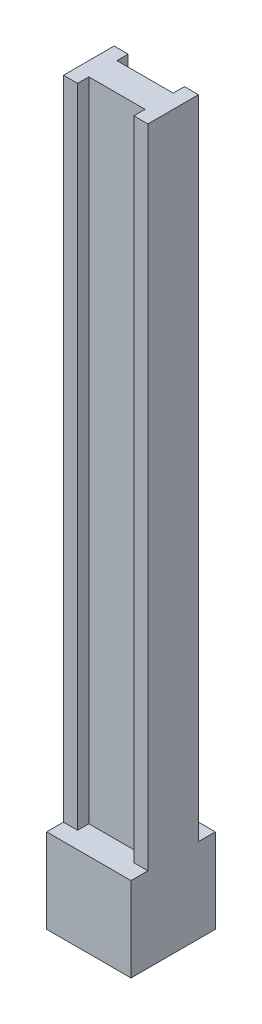
ISO-10303-21;
HEADER;
FILE_DESCRIPTION(('STEP AP214'),'2;1');
FILE_NAME('part.step','',(''),(''),'','','');
FILE_SCHEMA(('AUTOMOTIVE_DESIGN { 1 0 10303 214 1 1 1 1 }'));
ENDSEC;
DATA;
#1=APPLICATION_CONTEXT('core data for automotive mechanical design processes');
#2=APPLICATION_PROTOCOL_DEFINITION('international standard','automotive_design',2000,#1);
#3=PRODUCT_CONTEXT('',#1,'mechanical');
#4=PRODUCT('Part','Part','',(#3));
#5=PRODUCT_RELATED_PRODUCT_CATEGORY('part','',(#4));
#6=PRODUCT_DEFINITION_FORMATION('','',#4);
#7=PRODUCT_DEFINITION_CONTEXT('part definition',#1,'design');
#8=PRODUCT_DEFINITION('design','',#6,#7);
#9=PRODUCT_DEFINITION_SHAPE('','',#8);
#10=(LENGTH_UNIT() NAMED_UNIT(*) SI_UNIT(.MILLI.,.METRE.));
#11=(NAMED_UNIT(*) PLANE_ANGLE_UNIT() SI_UNIT($,.RADIAN.));
#12=(NAMED_UNIT(*) SI_UNIT($,.STERADIAN.) SOLID_ANGLE_UNIT());
#13=UNCERTAINTY_MEASURE_WITH_UNIT(LENGTH_MEASURE(1.E-05),#10,'distance_accuracy_value','');
#14=(GEOMETRIC_REPRESENTATION_CONTEXT(3) GLOBAL_UNCERTAINTY_ASSIGNED_CONTEXT((#13)) GLOBAL_UNIT_ASSIGNED_CONTEXT((#10,
#11,#12)) REPRESENTATION_CONTEXT('',''));
#15=CARTESIAN_POINT('',(0.,0.,0.));
#16=DIRECTION('',(0.,0.,1.));
#17=DIRECTION('',(1.,0.,0.));
#18=AXIS2_PLACEMENT_3D('',#15,#16,#17);
#19=CARTESIAN_POINT('',(75.,1300.,-75.));
#20=DIRECTION('',(-1.,0.,0.));
#21=DIRECTION('',(0.,0.,1.));
#22=AXIS2_PLACEMENT_3D('',#19,#20,#21);
#23=PLANE('',#22);
#24=DIRECTION('',(0.,1.,0.));
#25=VECTOR('',#24,1.);
#26=CARTESIAN_POINT('',(75.,-2.97058540778328,45.));
#27=LINE('',#26,#25);
#28=CARTESIAN_POINT('',(75.,150.,45.));
#29=VERTEX_POINT('',#28);
#30=CARTESIAN_POINT('',(75.,1300.,45.));
#31=VERTEX_POINT('',#30);
#32=EDGE_CURVE('E164',#29,#31,#27,.T.);
#33=ORIENTED_EDGE('',*,*,#32,.F.);
#34=DIRECTION('',(0.,0.,-1.));
#35=VECTOR('',#34,1.);
#36=CARTESIAN_POINT('',(75.,150.,45.));
#37=LINE('',#36,#35);
#38=CARTESIAN_POINT('',(75.,150.,75.));
#39=VERTEX_POINT('',#38);
#40=EDGE_CURVE('E149',#39,#29,#37,.T.);
#41=ORIENTED_EDGE('',*,*,#40,.F.);
#42=DIRECTION('',(0.,-1.,0.));
#43=VECTOR('',#42,1.);
#44=CARTESIAN_POINT('',(75.,1300.,75.));
#45=LINE('',#44,#43);
#46=CARTESIAN_POINT('',(75.,0.,75.));
#47=VERTEX_POINT('',#46);
#48=EDGE_CURVE('E161',#39,#47,#45,.T.);
#49=ORIENTED_EDGE('',*,*,#48,.T.);
#50=DIRECTION('',(0.,0.,-1.));
#51=VECTOR('',#50,1.);
#52=CARTESIAN_POINT('',(75.,0.,-75.));
#53=LINE('',#52,#51);
#54=CARTESIAN_POINT('',(75.,0.,-75.));
#55=VERTEX_POINT('',#54);
#56=EDGE_CURVE('E196',#47,#55,#53,.T.);
#57=ORIENTED_EDGE('',*,*,#56,.T.);
#58=DIRECTION('',(0.,-1.,0.));
#59=VECTOR('',#58,1.);
#60=CARTESIAN_POINT('',(75.,1300.,-75.));
#61=LINE('',#60,#59);
#62=CARTESIAN_POINT('',(75.,150.,-75.));
#63=VERTEX_POINT('',#62);
#64=EDGE_CURVE('E11',#63,#55,#61,.T.);
#65=ORIENTED_EDGE('',*,*,#64,.F.);
#66=DIRECTION('',(0.,0.,-1.));
#67=VECTOR('',#66,1.);
#68=CARTESIAN_POINT('',(75.,150.,-45.));
#69=LINE('',#68,#67);
#70=CARTESIAN_POINT('',(75.,150.,-45.));
#71=VERTEX_POINT('',#70);
#72=EDGE_CURVE('E249',#71,#63,#69,.T.);
#73=ORIENTED_EDGE('',*,*,#72,.F.);
#74=DIRECTION('',(0.,1.,0.));
#75=VECTOR('',#74,1.);
#76=CARTESIAN_POINT('',(75.,-2.97058540778328,-45.));
#77=LINE('',#76,#75);
#78=CARTESIAN_POINT('',(75.,1300.,-45.));
#79=VERTEX_POINT('',#78);
#80=EDGE_CURVE('E253',#71,#79,#77,.T.);
#81=ORIENTED_EDGE('',*,*,#80,.T.);
#82=DIRECTION('',(0.,0.,-1.));
#83=VECTOR('',#82,1.);
#84=CARTESIAN_POINT('',(75.,1300.,-75.));
#85=LINE('',#84,#83);
#86=EDGE_CURVE('E175',#31,#79,#85,.T.);
#87=ORIENTED_EDGE('',*,*,#86,.F.);
#88=EDGE_LOOP('',(#33,#41,#49,#57,#65,#73,#81,#87));
#89=FACE_BOUND('',#88,.T.);
#90=ADVANCED_FACE('F33',(#89),#23,.F.);
#91=CARTESIAN_POINT('',(-75.,1300.,-75.));
#92=DIRECTION('',(0.,0.,1.));
#93=DIRECTION('',(1.,0.,0.));
#94=AXIS2_PLACEMENT_3D('',#91,#92,#93);
#95=PLANE('',#94);
#96=DIRECTION('',(0.,-1.,0.));
#97=VECTOR('',#96,1.);
#98=CARTESIAN_POINT('',(-75.,1300.,-75.));
#99=LINE('',#98,#97);
#100=CARTESIAN_POINT('',(-75.,150.,-75.));
#101=VERTEX_POINT('',#100);
#102=CARTESIAN_POINT('',(-75.,0.,-75.));
#103=VERTEX_POINT('',#102);
#104=EDGE_CURVE('E40',#101,#103,#99,.T.);
#105=ORIENTED_EDGE('',*,*,#104,.F.);
#106=DIRECTION('',(-1.,0.,0.));
#107=VECTOR('',#106,1.);
#108=CARTESIAN_POINT('',(50.,150.,-75.));
#109=LINE('',#108,#107);
#110=EDGE_CURVE('E206',#63,#101,#109,.T.);
#111=ORIENTED_EDGE('',*,*,#110,.F.);
#112=ORIENTED_EDGE('',*,*,#64,.T.);
#113=DIRECTION('',(-1.,0.,0.));
#114=VECTOR('',#113,1.);
#115=CARTESIAN_POINT('',(-75.,0.,-75.));
#116=LINE('',#115,#114);
#117=EDGE_CURVE('E192',#55,#103,#116,.T.);
#118=ORIENTED_EDGE('',*,*,#117,.T.);
#119=EDGE_LOOP('',(#105,#111,#112,#118));
#120=FACE_BOUND('',#119,.T.);
#121=ADVANCED_FACE('F193',(#120),#95,.F.);
#122=CARTESIAN_POINT('',(-75.,1300.,-75.));
#123=DIRECTION('',(1.,0.,0.));
#124=DIRECTION('',(0.,0.,-1.));
#125=AXIS2_PLACEMENT_3D('',#122,#123,#124);
#126=PLANE('',#125);
#127=DIRECTION('',(0.,-1.,0.));
#128=VECTOR('',#127,1.);
#129=CARTESIAN_POINT('',(-75.,1300.,75.));
#130=LINE('',#129,#128);
#131=CARTESIAN_POINT('',(-75.,150.,75.));
#132=VERTEX_POINT('',#131);
#133=CARTESIAN_POINT('',(-75.,0.,75.));
#134=VERTEX_POINT('',#133);
#135=EDGE_CURVE('E170',#132,#134,#130,.T.);
#136=ORIENTED_EDGE('',*,*,#135,.F.);
#137=DIRECTION('',(0.,0.,1.));
#138=VECTOR('',#137,1.);
#139=CARTESIAN_POINT('',(-75.,150.,45.));
#140=LINE('',#139,#138);
#141=CARTESIAN_POINT('',(-75.,150.,45.));
#142=VERTEX_POINT('',#141);
#143=EDGE_CURVE('E152',#142,#132,#140,.T.);
#144=ORIENTED_EDGE('',*,*,#143,.F.);
#145=DIRECTION('',(0.,1.,0.));
#146=VECTOR('',#145,1.);
#147=CARTESIAN_POINT('',(-75.,-2.97058540778328,45.));
#148=LINE('',#147,#146);
#149=CARTESIAN_POINT('',(-75.,1300.,45.));
#150=VERTEX_POINT('',#149);
#151=EDGE_CURVE('E270',#142,#150,#148,.T.);
#152=ORIENTED_EDGE('',*,*,#151,.T.);
#153=DIRECTION('',(0.,0.,1.));
#154=VECTOR('',#153,1.);
#155=CARTESIAN_POINT('',(-75.,1300.,-75.));
#156=LINE('',#155,#154);
#157=CARTESIAN_POINT('',(-75.,1300.,-45.));
#158=VERTEX_POINT('',#157);
#159=EDGE_CURVE('E171',#158,#150,#156,.T.);
#160=ORIENTED_EDGE('',*,*,#159,.F.);
#161=DIRECTION('',(0.,1.,0.));
#162=VECTOR('',#161,1.);
#163=CARTESIAN_POINT('',(-75.,-2.97058540778328,-45.));
#164=LINE('',#163,#162);
#165=CARTESIAN_POINT('',(-75.,150.,-45.));
#166=VERTEX_POINT('',#165);
#167=EDGE_CURVE('E250',#166,#158,#164,.T.);
#168=ORIENTED_EDGE('',*,*,#167,.F.);
#169=DIRECTION('',(0.,0.,1.));
#170=VECTOR('',#169,1.);
#171=CARTESIAN_POINT('',(-75.,150.,-45.));
#172=LINE('',#171,#170);
#173=EDGE_CURVE('E189',#101,#166,#172,.T.);
#174=ORIENTED_EDGE('',*,*,#173,.F.);
#175=ORIENTED_EDGE('',*,*,#104,.T.);
#176=DIRECTION('',(0.,0.,1.));
#177=VECTOR('',#176,1.);
#178=CARTESIAN_POINT('',(-75.,0.,-75.));
#179=LINE('',#178,#177);
#180=EDGE_CURVE('E186',#103,#134,#179,.T.);
#181=ORIENTED_EDGE('',*,*,#180,.T.);
#182=EDGE_LOOP('',(#136,#144,#152,#160,#168,#174,#175,#181));
#183=FACE_BOUND('',#182,.T.);
#184=ADVANCED_FACE('F184',(#183),#126,.F.);
#185=CARTESIAN_POINT('',(-75.,1300.,75.));
#186=DIRECTION('',(0.,0.,-1.));
#187=DIRECTION('',(-1.,0.,0.));
#188=AXIS2_PLACEMENT_3D('',#185,#186,#187);
#189=PLANE('',#188);
#190=ORIENTED_EDGE('',*,*,#48,.F.);
#191=DIRECTION('',(1.,0.,0.));
#192=VECTOR('',#191,1.);
#193=CARTESIAN_POINT('',(50.,150.,75.));
#194=LINE('',#193,#192);
#195=EDGE_CURVE('E144',#132,#39,#194,.T.);
#196=ORIENTED_EDGE('',*,*,#195,.F.);
#197=ORIENTED_EDGE('',*,*,#135,.T.);
#198=DIRECTION('',(1.,0.,0.));
#199=VECTOR('',#198,1.);
#200=CARTESIAN_POINT('',(-75.,0.,75.));
#201=LINE('',#200,#199);
#202=EDGE_CURVE('E168',#134,#47,#201,.T.);
#203=ORIENTED_EDGE('',*,*,#202,.T.);
#204=EDGE_LOOP('',(#190,#196,#197,#203));
#205=FACE_BOUND('',#204,.T.);
#206=ADVANCED_FACE('F166',(#205),#189,.F.);
#207=CARTESIAN_POINT('',(75.,1300.,75.));
#208=DIRECTION('',(0.,1.,0.));
#209=DIRECTION('',(0.,0.,1.));
#210=AXIS2_PLACEMENT_3D('',#207,#208,#209);
#211=PLANE('',#210);
#212=DIRECTION('',(-1.,0.,0.));
#213=VECTOR('',#212,1.);
#214=CARTESIAN_POINT('',(-75.,1300.,45.));
#215=LINE('',#214,#213);
#216=CARTESIAN_POINT('',(50.,1300.,45.));
#217=VERTEX_POINT('',#216);
#218=EDGE_CURVE('E47',#31,#217,#215,.T.);
#219=ORIENTED_EDGE('',*,*,#218,.F.);
#220=ORIENTED_EDGE('',*,*,#86,.T.);
#221=DIRECTION('',(1.,0.,0.));
#222=VECTOR('',#221,1.);
#223=CARTESIAN_POINT('',(-75.,1300.,-45.));
#224=LINE('',#223,#222);
#225=CARTESIAN_POINT('',(50.,1300.,-45.));
#226=VERTEX_POINT('',#225);
#227=EDGE_CURVE('E264',#226,#79,#224,.T.);
#228=ORIENTED_EDGE('',*,*,#227,.F.);
#229=DIRECTION('',(0.,0.,-1.));
#230=VECTOR('',#229,1.);
#231=CARTESIAN_POINT('',(50.,1300.,-25.));
#232=LINE('',#231,#230);
#233=CARTESIAN_POINT('',(50.,1300.,-25.));
#234=VERTEX_POINT('',#233);
#235=EDGE_CURVE('E208',#234,#226,#232,.T.);
#236=ORIENTED_EDGE('',*,*,#235,.F.);
#237=DIRECTION('',(1.,0.,0.));
#238=VECTOR('',#237,1.);
#239=CARTESIAN_POINT('',(50.,1300.,-25.));
#240=LINE('',#239,#238);
#241=CARTESIAN_POINT('',(-50.,1300.,-25.));
#242=VERTEX_POINT('',#241);
#243=EDGE_CURVE('E212',#242,#234,#240,.T.);
#244=ORIENTED_EDGE('',*,*,#243,.F.);
#245=DIRECTION('',(0.,0.,1.));
#246=VECTOR('',#245,1.);
#247=CARTESIAN_POINT('',(-50.,1300.,-25.));
#248=LINE('',#247,#246);
#249=CARTESIAN_POINT('',(-50.,1300.,-45.));
#250=VERTEX_POINT('',#249);
#251=EDGE_CURVE('E215',#250,#242,#248,.T.);
#252=ORIENTED_EDGE('',*,*,#251,.F.);
#253=EDGE_CURVE('E258',#158,#250,#224,.T.);
#254=ORIENTED_EDGE('',*,*,#253,.F.);
#255=ORIENTED_EDGE('',*,*,#159,.T.);
#256=CARTESIAN_POINT('',(-50.,1300.,45.));
#257=VERTEX_POINT('',#256);
#258=EDGE_CURVE('E276',#257,#150,#215,.T.);
#259=ORIENTED_EDGE('',*,*,#258,.F.);
#260=DIRECTION('',(0.,0.,1.));
#261=VECTOR('',#260,1.);
#262=CARTESIAN_POINT('',(-50.,1300.,25.));
#263=LINE('',#262,#261);
#264=CARTESIAN_POINT('',(-50.,1300.,25.));
#265=VERTEX_POINT('',#264);
#266=EDGE_CURVE('E229',#265,#257,#263,.T.);
#267=ORIENTED_EDGE('',*,*,#266,.F.);
#268=DIRECTION('',(-1.,0.,0.));
#269=VECTOR('',#268,1.);
#270=CARTESIAN_POINT('',(50.,1300.,25.));
#271=LINE('',#270,#269);
#272=CARTESIAN_POINT('',(50.,1300.,25.));
#273=VERTEX_POINT('',#272);
#274=EDGE_CURVE('E233',#273,#265,#271,.T.);
#275=ORIENTED_EDGE('',*,*,#274,.F.);
#276=DIRECTION('',(0.,0.,-1.));
#277=VECTOR('',#276,1.);
#278=CARTESIAN_POINT('',(50.,1300.,25.));
#279=LINE('',#278,#277);
#280=EDGE_CURVE('E236',#217,#273,#279,.T.);
#281=ORIENTED_EDGE('',*,*,#280,.F.);
#282=EDGE_LOOP('',(#219,#220,#228,#236,#244,#252,#254,#255,#259,#267,#275,#281));
#283=FACE_BOUND('',#282,.T.);
#284=ADVANCED_FACE('F283',(#283),#211,.T.);
#285=CARTESIAN_POINT('',(75.,0.,75.));
#286=DIRECTION('',(0.,1.,0.));
#287=DIRECTION('',(0.,0.,1.));
#288=AXIS2_PLACEMENT_3D('',#285,#286,#287);
#289=PLANE('',#288);
#290=ORIENTED_EDGE('',*,*,#56,.F.);
#291=ORIENTED_EDGE('',*,*,#202,.F.);
#292=ORIENTED_EDGE('',*,*,#180,.F.);
#293=ORIENTED_EDGE('',*,*,#117,.F.);
#294=EDGE_LOOP('',(#290,#291,#292,#293));
#295=FACE_BOUND('',#294,.T.);
#296=ADVANCED_FACE('F198',(#295),#289,.F.);
#297=CARTESIAN_POINT('',(-50.,150.,-25.));
#298=DIRECTION('',(-1.,0.,0.));
#299=DIRECTION('',(0.,0.,1.));
#300=AXIS2_PLACEMENT_3D('',#297,#298,#299);
#301=PLANE('',#300);
#302=DIRECTION('',(0.,0.,1.));
#303=VECTOR('',#302,1.);
#304=CARTESIAN_POINT('',(-50.,150.,-25.));
#305=LINE('',#304,#303);
#306=CARTESIAN_POINT('',(-50.,150.,-45.));
#307=VERTEX_POINT('',#306);
#308=CARTESIAN_POINT('',(-50.,150.,-25.));
#309=VERTEX_POINT('',#308);
#310=EDGE_CURVE('E211',#307,#309,#305,.T.);
#311=ORIENTED_EDGE('',*,*,#310,.F.);
#312=DIRECTION('',(0.,1.,0.));
#313=VECTOR('',#312,1.);
#314=CARTESIAN_POINT('',(-50.,150.,-45.));
#315=LINE('',#314,#313);
#316=EDGE_CURVE('E237',#307,#250,#315,.T.);
#317=ORIENTED_EDGE('',*,*,#316,.T.);
#318=ORIENTED_EDGE('',*,*,#251,.T.);
#319=DIRECTION('',(0.,1.,0.));
#320=VECTOR('',#319,1.);
#321=CARTESIAN_POINT('',(-50.,150.,-25.));
#322=LINE('',#321,#320);
#323=EDGE_CURVE('E203',#309,#242,#322,.T.);
#324=ORIENTED_EDGE('',*,*,#323,.F.);
#325=EDGE_LOOP('',(#311,#317,#318,#324));
#326=FACE_BOUND('',#325,.T.);
#327=ADVANCED_FACE('F290',(#326),#301,.F.);
#328=CARTESIAN_POINT('',(50.,150.,-25.));
#329=DIRECTION('',(1.,0.,0.));
#330=DIRECTION('',(0.,0.,-1.));
#331=AXIS2_PLACEMENT_3D('',#328,#329,#330);
#332=PLANE('',#331);
#333=ORIENTED_EDGE('',*,*,#235,.T.);
#334=DIRECTION('',(0.,-1.,0.));
#335=VECTOR('',#334,1.);
#336=CARTESIAN_POINT('',(50.,150.,-45.));
#337=LINE('',#336,#335);
#338=CARTESIAN_POINT('',(50.,150.,-45.));
#339=VERTEX_POINT('',#338);
#340=EDGE_CURVE('E246',#226,#339,#337,.T.);
#341=ORIENTED_EDGE('',*,*,#340,.T.);
#342=DIRECTION('',(0.,0.,-1.));
#343=VECTOR('',#342,1.);
#344=CARTESIAN_POINT('',(50.,150.,-25.));
#345=LINE('',#344,#343);
#346=CARTESIAN_POINT('',(50.,150.,-25.));
#347=VERTEX_POINT('',#346);
#348=EDGE_CURVE('E219',#347,#339,#345,.T.);
#349=ORIENTED_EDGE('',*,*,#348,.F.);
#350=DIRECTION('',(0.,1.,0.));
#351=VECTOR('',#350,1.);
#352=CARTESIAN_POINT('',(50.,150.,-25.));
#353=LINE('',#352,#351);
#354=EDGE_CURVE('E200',#347,#234,#353,.T.);
#355=ORIENTED_EDGE('',*,*,#354,.T.);
#356=EDGE_LOOP('',(#333,#341,#349,#355));
#357=FACE_BOUND('',#356,.T.);
#358=ADVANCED_FACE('F303',(#357),#332,.F.);
#359=CARTESIAN_POINT('',(50.,150.,-25.));
#360=DIRECTION('',(0.,0.,1.));
#361=DIRECTION('',(1.,0.,0.));
#362=AXIS2_PLACEMENT_3D('',#359,#360,#361);
#363=PLANE('',#362);
#364=ORIENTED_EDGE('',*,*,#243,.T.);
#365=ORIENTED_EDGE('',*,*,#354,.F.);
#366=DIRECTION('',(1.,0.,0.));
#367=VECTOR('',#366,1.);
#368=CARTESIAN_POINT('',(50.,150.,-25.));
#369=LINE('',#368,#367);
#370=EDGE_CURVE('E222',#309,#347,#369,.T.);
#371=ORIENTED_EDGE('',*,*,#370,.F.);
#372=ORIENTED_EDGE('',*,*,#323,.T.);
#373=EDGE_LOOP('',(#364,#365,#371,#372));
#374=FACE_BOUND('',#373,.T.);
#375=ADVANCED_FACE('F306',(#374),#363,.F.);
#376=CARTESIAN_POINT('',(-50.,150.,-75.));
#377=DIRECTION('',(0.,1.,0.));
#378=DIRECTION('',(0.,0.,1.));
#379=AXIS2_PLACEMENT_3D('',#376,#377,#378);
#380=PLANE('',#379);
#381=ORIENTED_EDGE('',*,*,#348,.T.);
#382=DIRECTION('',(1.,0.,0.));
#383=VECTOR('',#382,1.);
#384=CARTESIAN_POINT('',(-75.,150.,-45.));
#385=LINE('',#384,#383);
#386=EDGE_CURVE('E252',#339,#71,#385,.T.);
#387=ORIENTED_EDGE('',*,*,#386,.T.);
#388=ORIENTED_EDGE('',*,*,#72,.T.);
#389=ORIENTED_EDGE('',*,*,#110,.T.);
#390=ORIENTED_EDGE('',*,*,#173,.T.);
#391=EDGE_CURVE('E256',#166,#307,#385,.T.);
#392=ORIENTED_EDGE('',*,*,#391,.T.);
#393=ORIENTED_EDGE('',*,*,#310,.T.);
#394=ORIENTED_EDGE('',*,*,#370,.T.);
#395=EDGE_LOOP('',(#381,#387,#388,#389,#390,#392,#393,#394));
#396=FACE_BOUND('',#395,.T.);
#397=ADVANCED_FACE('F294',(#396),#380,.T.);
#398=CARTESIAN_POINT('',(50.,150.,25.));
#399=DIRECTION('',(1.,0.,0.));
#400=DIRECTION('',(0.,0.,-1.));
#401=AXIS2_PLACEMENT_3D('',#398,#399,#400);
#402=PLANE('',#401);
#403=DIRECTION('',(0.,0.,-1.));
#404=VECTOR('',#403,1.);
#405=CARTESIAN_POINT('',(50.,150.,25.));
#406=LINE('',#405,#404);
#407=CARTESIAN_POINT('',(50.,150.,45.));
#408=VERTEX_POINT('',#407);
#409=CARTESIAN_POINT('',(50.,150.,25.));
#410=VERTEX_POINT('',#409);
#411=EDGE_CURVE('E232',#408,#410,#406,.T.);
#412=ORIENTED_EDGE('',*,*,#411,.F.);
#413=DIRECTION('',(0.,1.,0.));
#414=VECTOR('',#413,1.);
#415=CARTESIAN_POINT('',(50.,150.,45.));
#416=LINE('',#415,#414);
#417=EDGE_CURVE('E265',#408,#217,#416,.T.);
#418=ORIENTED_EDGE('',*,*,#417,.T.);
#419=ORIENTED_EDGE('',*,*,#280,.T.);
#420=DIRECTION('',(0.,1.,0.));
#421=VECTOR('',#420,1.);
#422=CARTESIAN_POINT('',(50.,150.,25.));
#423=LINE('',#422,#421);
#424=EDGE_CURVE('E156',#410,#273,#423,.T.);
#425=ORIENTED_EDGE('',*,*,#424,.F.);
#426=EDGE_LOOP('',(#412,#418,#419,#425));
#427=FACE_BOUND('',#426,.T.);
#428=ADVANCED_FACE('F313',(#427),#402,.F.);
#429=CARTESIAN_POINT('',(-50.,150.,25.));
#430=DIRECTION('',(-1.,0.,0.));
#431=DIRECTION('',(0.,0.,1.));
#432=AXIS2_PLACEMENT_3D('',#429,#430,#431);
#433=PLANE('',#432);
#434=ORIENTED_EDGE('',*,*,#266,.T.);
#435=DIRECTION('',(0.,-1.,0.));
#436=VECTOR('',#435,1.);
#437=CARTESIAN_POINT('',(-50.,150.,45.));
#438=LINE('',#437,#436);
#439=CARTESIAN_POINT('',(-50.,150.,45.));
#440=VERTEX_POINT('',#439);
#441=EDGE_CURVE('E267',#257,#440,#438,.T.);
#442=ORIENTED_EDGE('',*,*,#441,.T.);
#443=DIRECTION('',(0.,0.,1.));
#444=VECTOR('',#443,1.);
#445=CARTESIAN_POINT('',(-50.,150.,25.));
#446=LINE('',#445,#444);
#447=CARTESIAN_POINT('',(-50.,150.,25.));
#448=VERTEX_POINT('',#447);
#449=EDGE_CURVE('E157',#448,#440,#446,.T.);
#450=ORIENTED_EDGE('',*,*,#449,.F.);
#451=DIRECTION('',(0.,1.,0.));
#452=VECTOR('',#451,1.);
#453=CARTESIAN_POINT('',(-50.,150.,25.));
#454=LINE('',#453,#452);
#455=EDGE_CURVE('E217',#448,#265,#454,.T.);
#456=ORIENTED_EDGE('',*,*,#455,.T.);
#457=EDGE_LOOP('',(#434,#442,#450,#456));
#458=FACE_BOUND('',#457,.T.);
#459=ADVANCED_FACE('F360',(#458),#433,.F.);
#460=CARTESIAN_POINT('',(50.,150.,25.));
#461=DIRECTION('',(0.,0.,-1.));
#462=DIRECTION('',(-1.,0.,0.));
#463=AXIS2_PLACEMENT_3D('',#460,#461,#462);
#464=PLANE('',#463);
#465=ORIENTED_EDGE('',*,*,#274,.T.);
#466=ORIENTED_EDGE('',*,*,#455,.F.);
#467=DIRECTION('',(-1.,0.,0.));
#468=VECTOR('',#467,1.);
#469=CARTESIAN_POINT('',(50.,150.,25.));
#470=LINE('',#469,#468);
#471=EDGE_CURVE('E240',#410,#448,#470,.T.);
#472=ORIENTED_EDGE('',*,*,#471,.F.);
#473=ORIENTED_EDGE('',*,*,#424,.T.);
#474=EDGE_LOOP('',(#465,#466,#472,#473));
#475=FACE_BOUND('',#474,.T.);
#476=ADVANCED_FACE('F370',(#475),#464,.F.);
#477=CARTESIAN_POINT('',(50.,150.,75.));
#478=DIRECTION('',(0.,-1.,0.));
#479=DIRECTION('',(0.,0.,-1.));
#480=AXIS2_PLACEMENT_3D('',#477,#478,#479);
#481=PLANE('',#480);
#482=ORIENTED_EDGE('',*,*,#449,.T.);
#483=DIRECTION('',(-1.,0.,0.));
#484=VECTOR('',#483,1.);
#485=CARTESIAN_POINT('',(-75.,150.,45.));
#486=LINE('',#485,#484);
#487=EDGE_CURVE('E55',#440,#142,#486,.T.);
#488=ORIENTED_EDGE('',*,*,#487,.T.);
#489=ORIENTED_EDGE('',*,*,#143,.T.);
#490=ORIENTED_EDGE('',*,*,#195,.T.);
#491=ORIENTED_EDGE('',*,*,#40,.T.);
#492=EDGE_CURVE('E272',#29,#408,#486,.T.);
#493=ORIENTED_EDGE('',*,*,#492,.T.);
#494=ORIENTED_EDGE('',*,*,#411,.T.);
#495=ORIENTED_EDGE('',*,*,#471,.T.);
#496=EDGE_LOOP('',(#482,#488,#489,#490,#491,#493,#494,#495));
#497=FACE_BOUND('',#496,.T.);
#498=ADVANCED_FACE('F147',(#497),#481,.F.);
#499=CARTESIAN_POINT('',(-75.,-2.97058540778328,-45.));
#500=DIRECTION('',(0.,0.,1.));
#501=DIRECTION('',(1.,0.,0.));
#502=AXIS2_PLACEMENT_3D('',#499,#500,#501);
#503=PLANE('',#502);
#504=ORIENTED_EDGE('',*,*,#227,.T.);
#505=ORIENTED_EDGE('',*,*,#80,.F.);
#506=ORIENTED_EDGE('',*,*,#386,.F.);
#507=ORIENTED_EDGE('',*,*,#340,.F.);
#508=EDGE_LOOP('',(#504,#505,#506,#507));
#509=FACE_BOUND('',#508,.T.);
#510=ADVANCED_FACE('F299',(#509),#503,.F.);
#511=ORIENTED_EDGE('',*,*,#391,.F.);
#512=ORIENTED_EDGE('',*,*,#167,.T.);
#513=ORIENTED_EDGE('',*,*,#253,.T.);
#514=ORIENTED_EDGE('',*,*,#316,.F.);
#515=EDGE_LOOP('',(#511,#512,#513,#514));
#516=FACE_BOUND('',#515,.T.);
#517=ADVANCED_FACE('F287',(#516),#503,.F.);
#518=CARTESIAN_POINT('',(-75.,-2.97058540778328,45.));
#519=DIRECTION('',(0.,0.,-1.));
#520=DIRECTION('',(-1.,0.,0.));
#521=AXIS2_PLACEMENT_3D('',#518,#519,#520);
#522=PLANE('',#521);
#523=ORIENTED_EDGE('',*,*,#258,.T.);
#524=ORIENTED_EDGE('',*,*,#151,.F.);
#525=ORIENTED_EDGE('',*,*,#487,.F.);
#526=ORIENTED_EDGE('',*,*,#441,.F.);
#527=EDGE_LOOP('',(#523,#524,#525,#526));
#528=FACE_BOUND('',#527,.T.);
#529=ADVANCED_FACE('F278',(#528),#522,.F.);
#530=ORIENTED_EDGE('',*,*,#492,.F.);
#531=ORIENTED_EDGE('',*,*,#32,.T.);
#532=ORIENTED_EDGE('',*,*,#218,.T.);
#533=ORIENTED_EDGE('',*,*,#417,.F.);
#534=EDGE_LOOP('',(#530,#531,#532,#533));
#535=FACE_BOUND('',#534,.T.);
#536=ADVANCED_FACE('F404',(#535),#522,.F.);
#537=CLOSED_SHELL('',(#90,#121,#184,#206,#284,#296,#327,#358,#375,#397,#428,#459,#476,#498,#510,
#517,#529,#536));
#538=MANIFOLD_SOLID_BREP('B2',#537);
#539=ADVANCED_BREP_SHAPE_REPRESENTATION('',(#18,#538),#14);
#540=SHAPE_DEFINITION_REPRESENTATION(#9,#539);
ENDSEC;
END-ISO-10303-21;
